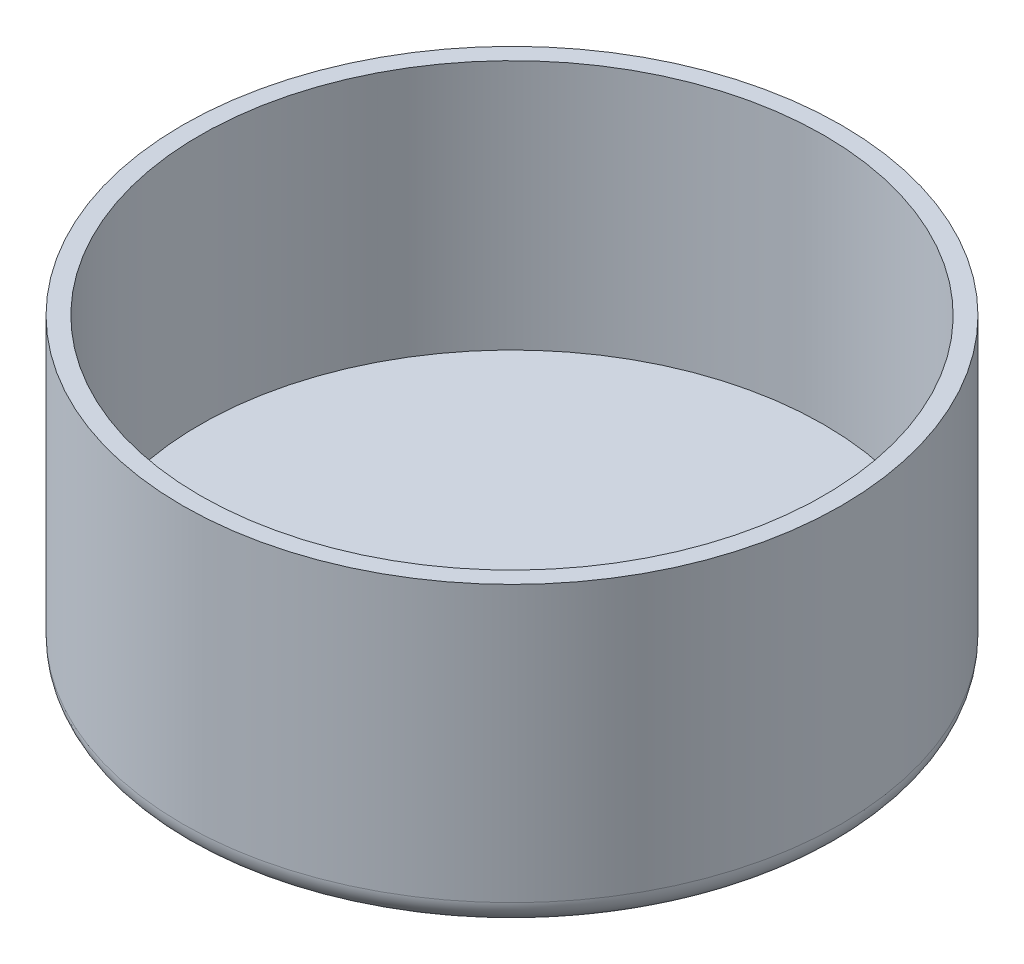
ISO-10303-21;
HEADER;
FILE_DESCRIPTION(('STEP AP214'),'2;1');
FILE_NAME('part.step','',(''),(''),'','','');
FILE_SCHEMA(('AUTOMOTIVE_DESIGN { 1 0 10303 214 1 1 1 1 }'));
ENDSEC;
DATA;
#1=APPLICATION_CONTEXT('core data for automotive mechanical design processes');
#2=APPLICATION_PROTOCOL_DEFINITION('international standard','automotive_design',2000,#1);
#3=PRODUCT_CONTEXT('',#1,'mechanical');
#4=PRODUCT('Part','Part','',(#3));
#5=PRODUCT_RELATED_PRODUCT_CATEGORY('part','',(#4));
#6=PRODUCT_DEFINITION_FORMATION('','',#4);
#7=PRODUCT_DEFINITION_CONTEXT('part definition',#1,'design');
#8=PRODUCT_DEFINITION('design','',#6,#7);
#9=PRODUCT_DEFINITION_SHAPE('','',#8);
#10=(LENGTH_UNIT() NAMED_UNIT(*) SI_UNIT(.MILLI.,.METRE.));
#11=(NAMED_UNIT(*) PLANE_ANGLE_UNIT() SI_UNIT($,.RADIAN.));
#12=(NAMED_UNIT(*) SI_UNIT($,.STERADIAN.) SOLID_ANGLE_UNIT());
#13=UNCERTAINTY_MEASURE_WITH_UNIT(LENGTH_MEASURE(1.E-05),#10,'distance_accuracy_value','');
#14=(GEOMETRIC_REPRESENTATION_CONTEXT(3) GLOBAL_UNCERTAINTY_ASSIGNED_CONTEXT((#13)) GLOBAL_UNIT_ASSIGNED_CONTEXT((#10,
#11,#12)) REPRESENTATION_CONTEXT('',''));
#15=CARTESIAN_POINT('',(0.,0.,0.));
#16=DIRECTION('',(0.,0.,1.));
#17=DIRECTION('',(1.,0.,0.));
#18=AXIS2_PLACEMENT_3D('',#15,#16,#17);
#19=CARTESIAN_POINT('',(0.,2.,0.));
#20=DIRECTION('',(0.,-1.,0.));
#21=DIRECTION('',(0.,0.,-1.));
#22=AXIS2_PLACEMENT_3D('',#19,#20,#21);
#23=CYLINDRICAL_SURFACE('',#22,13.15);
#24=CARTESIAN_POINT('',(0.,1.,0.));
#25=DIRECTION('',(0.,1.,0.));
#26=DIRECTION('',(0.,0.,1.));
#27=AXIS2_PLACEMENT_3D('',#24,#25,#26);
#28=CIRCLE('',#27,13.15);
#29=CARTESIAN_POINT('',(0.,1.,13.15));
#30=VERTEX_POINT('',#29);
#31=EDGE_CURVE('E38',#30,#30,#28,.T.);
#32=ORIENTED_EDGE('',*,*,#31,.T.);
#33=EDGE_LOOP('',(#32));
#34=FACE_BOUND('',#33,.T.);
#35=CARTESIAN_POINT('',(0.,12.,0.));
#36=DIRECTION('',(0.,1.,0.));
#37=DIRECTION('',(0.,0.,1.));
#38=AXIS2_PLACEMENT_3D('',#35,#36,#37);
#39=CIRCLE('',#38,13.15);
#40=CARTESIAN_POINT('',(0.,12.,13.15));
#41=VERTEX_POINT('',#40);
#42=EDGE_CURVE('E46',#41,#41,#39,.T.);
#43=ORIENTED_EDGE('',*,*,#42,.F.);
#44=EDGE_LOOP('',(#43));
#45=FACE_BOUND('',#44,.T.);
#46=ADVANCED_FACE('F31',(#34,#45),#23,.T.);
#47=CARTESIAN_POINT('',(0.,0.,0.));
#48=DIRECTION('',(0.,1.,0.));
#49=DIRECTION('',(0.,0.,1.));
#50=AXIS2_PLACEMENT_3D('',#47,#48,#49);
#51=PLANE('',#50);
#52=CARTESIAN_POINT('',(0.,0.,0.));
#53=DIRECTION('',(0.,1.,0.));
#54=DIRECTION('',(0.,0.,1.));
#55=AXIS2_PLACEMENT_3D('',#52,#53,#54);
#56=CIRCLE('',#55,12.15);
#57=CARTESIAN_POINT('',(0.,0.,12.15));
#58=VERTEX_POINT('',#57);
#59=EDGE_CURVE('E10',#58,#58,#56,.F.);
#60=ORIENTED_EDGE('',*,*,#59,.T.);
#61=EDGE_LOOP('',(#60));
#62=FACE_BOUND('',#61,.T.);
#63=ADVANCED_FACE('F60',(#62),#51,.F.);
#64=CARTESIAN_POINT('',(0.,12.,0.));
#65=DIRECTION('',(0.,1.,0.));
#66=DIRECTION('',(0.,0.,1.));
#67=AXIS2_PLACEMENT_3D('',#64,#65,#66);
#68=PLANE('',#67);
#69=ORIENTED_EDGE('',*,*,#42,.T.);
#70=EDGE_LOOP('',(#69));
#71=FACE_BOUND('',#70,.T.);
#72=CARTESIAN_POINT('',(0.,12.,0.));
#73=DIRECTION('',(0.,1.,0.));
#74=DIRECTION('',(0.,0.,1.));
#75=AXIS2_PLACEMENT_3D('',#72,#73,#74);
#76=CIRCLE('',#75,12.45);
#77=CARTESIAN_POINT('',(0.,12.,12.45));
#78=VERTEX_POINT('',#77);
#79=EDGE_CURVE('E51',#78,#78,#76,.T.);
#80=ORIENTED_EDGE('',*,*,#79,.F.);
#81=EDGE_LOOP('',(#80));
#82=FACE_BOUND('',#81,.T.);
#83=ADVANCED_FACE('F58',(#71,#82),#68,.T.);
#84=CARTESIAN_POINT('',(0.,12.,0.));
#85=DIRECTION('',(0.,-1.,0.));
#86=DIRECTION('',(0.,0.,-1.));
#87=AXIS2_PLACEMENT_3D('',#84,#85,#86);
#88=CYLINDRICAL_SURFACE('',#87,12.45);
#89=ORIENTED_EDGE('',*,*,#79,.T.);
#90=EDGE_LOOP('',(#89));
#91=FACE_BOUND('',#90,.T.);
#92=CARTESIAN_POINT('',(0.,2.,0.));
#93=DIRECTION('',(0.,1.,0.));
#94=DIRECTION('',(0.,0.,1.));
#95=AXIS2_PLACEMENT_3D('',#92,#93,#94);
#96=CIRCLE('',#95,12.45);
#97=CARTESIAN_POINT('',(0.,2.,12.45));
#98=VERTEX_POINT('',#97);
#99=EDGE_CURVE('E42',#98,#98,#96,.F.);
#100=ORIENTED_EDGE('',*,*,#99,.T.);
#101=EDGE_LOOP('',(#100));
#102=FACE_BOUND('',#101,.T.);
#103=ADVANCED_FACE('F55',(#91,#102),#88,.F.);
#104=CARTESIAN_POINT('',(0.,2.,0.));
#105=DIRECTION('',(0.,1.,0.));
#106=DIRECTION('',(0.,0.,1.));
#107=AXIS2_PLACEMENT_3D('',#104,#105,#106);
#108=PLANE('',#107);
#109=ORIENTED_EDGE('',*,*,#99,.F.);
#110=EDGE_LOOP('',(#109));
#111=FACE_BOUND('',#110,.T.);
#112=ADVANCED_FACE('F67',(#111),#108,.T.);
#113=CARTESIAN_POINT('',(0.,1.,0.));
#114=DIRECTION('',(0.,1.,0.));
#115=DIRECTION('',(0.,0.,1.));
#116=AXIS2_PLACEMENT_3D('',#113,#114,#115);
#117=TOROIDAL_SURFACE('',#116,12.15,1.);
#118=ORIENTED_EDGE('',*,*,#59,.F.);
#119=EDGE_LOOP('',(#118));
#120=FACE_BOUND('',#119,.T.);
#121=ORIENTED_EDGE('',*,*,#31,.F.);
#122=EDGE_LOOP('',(#121));
#123=FACE_BOUND('',#122,.T.);
#124=ADVANCED_FACE('F33',(#120,#123),#117,.T.);
#125=CLOSED_SHELL('',(#46,#63,#83,#103,#112,#124));
#126=MANIFOLD_SOLID_BREP('B2',#125);
#127=ADVANCED_BREP_SHAPE_REPRESENTATION('',(#18,#126),#14);
#128=SHAPE_DEFINITION_REPRESENTATION(#9,#127);
ENDSEC;
END-ISO-10303-21;
